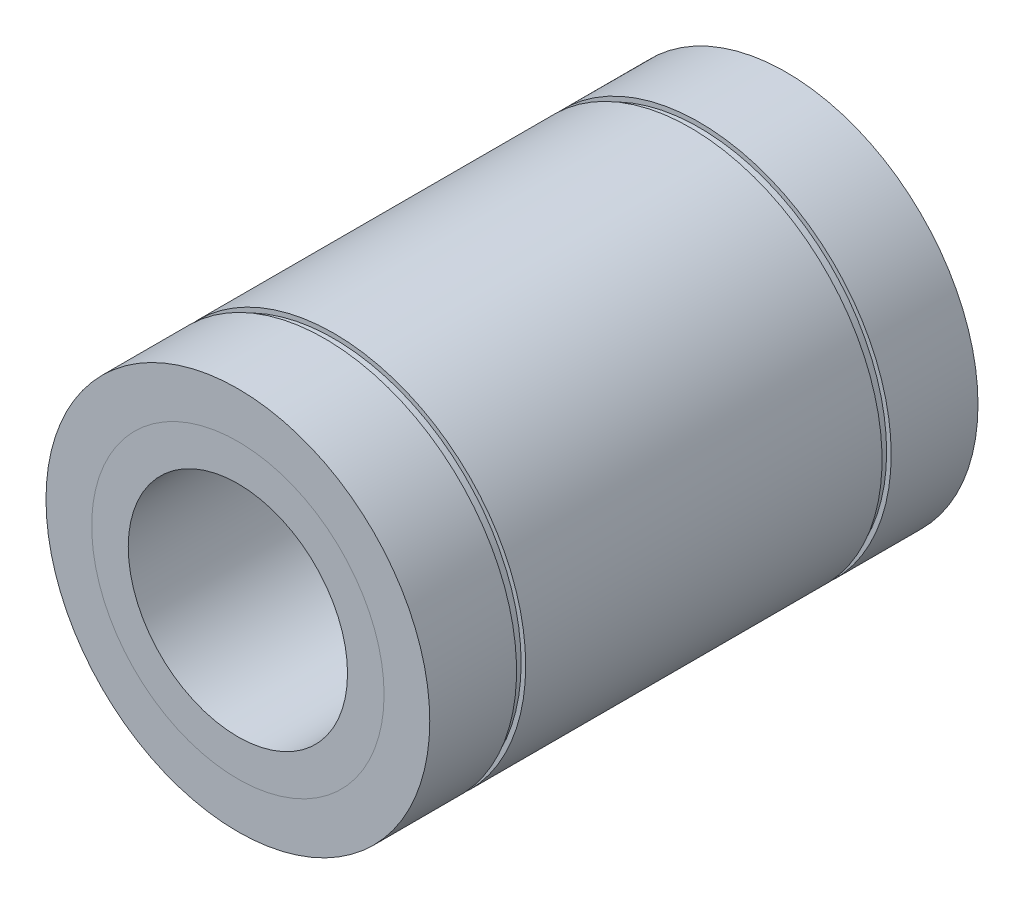
ISO-10303-21;
HEADER;
FILE_DESCRIPTION(('STEP AP214'),'2;1');
FILE_NAME('part.step','',(''),(''),'','','');
FILE_SCHEMA(('AUTOMOTIVE_DESIGN { 1 0 10303 214 1 1 1 1 }'));
ENDSEC;
DATA;
#1=APPLICATION_CONTEXT('core data for automotive mechanical design processes');
#2=APPLICATION_PROTOCOL_DEFINITION('international standard','automotive_design',2000,#1);
#3=PRODUCT_CONTEXT('',#1,'mechanical');
#4=PRODUCT('Part','Part','',(#3));
#5=PRODUCT_RELATED_PRODUCT_CATEGORY('part','',(#4));
#6=PRODUCT_DEFINITION_FORMATION('','',#4);
#7=PRODUCT_DEFINITION_CONTEXT('part definition',#1,'design');
#8=PRODUCT_DEFINITION('design','',#6,#7);
#9=PRODUCT_DEFINITION_SHAPE('','',#8);
#10=(LENGTH_UNIT() NAMED_UNIT(*) SI_UNIT(.MILLI.,.METRE.));
#11=(NAMED_UNIT(*) PLANE_ANGLE_UNIT() SI_UNIT($,.RADIAN.));
#12=(NAMED_UNIT(*) SI_UNIT($,.STERADIAN.) SOLID_ANGLE_UNIT());
#13=UNCERTAINTY_MEASURE_WITH_UNIT(LENGTH_MEASURE(1.E-05),#10,'distance_accuracy_value','');
#14=(GEOMETRIC_REPRESENTATION_CONTEXT(3) GLOBAL_UNCERTAINTY_ASSIGNED_CONTEXT((#13)) GLOBAL_UNIT_ASSIGNED_CONTEXT((#10,
#11,#12)) REPRESENTATION_CONTEXT('',''));
#15=CARTESIAN_POINT('',(0.,0.,0.));
#16=DIRECTION('',(0.,0.,1.));
#17=DIRECTION('',(1.,0.,0.));
#18=AXIS2_PLACEMENT_3D('',#15,#16,#17);
#19=CARTESIAN_POINT('',(0.,0.,15.));
#20=DIRECTION('',(0.,0.,1.));
#21=DIRECTION('',(1.,0.,0.));
#22=AXIS2_PLACEMENT_3D('',#19,#20,#21);
#23=PLANE('',#22);
#24=CARTESIAN_POINT('',(0.,0.,15.));
#25=DIRECTION('',(0.,0.,1.));
#26=DIRECTION('',(1.,0.,0.));
#27=AXIS2_PLACEMENT_3D('',#24,#25,#26);
#28=CIRCLE('',#27,8.);
#29=CARTESIAN_POINT('',(8.,0.,15.));
#30=VERTEX_POINT('',#29);
#31=EDGE_CURVE('E11',#30,#30,#28,.T.);
#32=ORIENTED_EDGE('',*,*,#31,.T.);
#33=EDGE_LOOP('',(#32));
#34=FACE_BOUND('',#33,.T.);
#35=CARTESIAN_POINT('',(0.,0.,15.));
#36=DIRECTION('',(0.,0.,1.));
#37=DIRECTION('',(1.,0.,0.));
#38=AXIS2_PLACEMENT_3D('',#35,#36,#37);
#39=CIRCLE('',#38,6.);
#40=CARTESIAN_POINT('',(6.,0.,15.));
#41=VERTEX_POINT('',#40);
#42=EDGE_CURVE('E62',#41,#41,#39,.T.);
#43=ORIENTED_EDGE('',*,*,#42,.F.);
#44=EDGE_LOOP('',(#43));
#45=FACE_BOUND('',#44,.T.);
#46=ADVANCED_FACE('F51',(#34,#45),#23,.T.);
#47=CARTESIAN_POINT('',(0.,0.,-15.));
#48=DIRECTION('',(0.,0.,1.));
#49=DIRECTION('',(1.,0.,0.));
#50=AXIS2_PLACEMENT_3D('',#47,#48,#49);
#51=PLANE('',#50);
#52=CARTESIAN_POINT('',(0.,0.,-15.));
#53=DIRECTION('',(0.,0.,1.));
#54=DIRECTION('',(1.,0.,0.));
#55=AXIS2_PLACEMENT_3D('',#52,#53,#54);
#56=CIRCLE('',#55,8.);
#57=CARTESIAN_POINT('',(8.,0.,-15.));
#58=VERTEX_POINT('',#57);
#59=EDGE_CURVE('E55',#58,#58,#56,.T.);
#60=ORIENTED_EDGE('',*,*,#59,.F.);
#61=EDGE_LOOP('',(#60));
#62=FACE_BOUND('',#61,.T.);
#63=CARTESIAN_POINT('',(0.,0.,-15.));
#64=DIRECTION('',(0.,0.,1.));
#65=DIRECTION('',(1.,0.,0.));
#66=AXIS2_PLACEMENT_3D('',#63,#64,#65);
#67=CIRCLE('',#66,6.);
#68=CARTESIAN_POINT('',(6.,0.,-15.));
#69=VERTEX_POINT('',#68);
#70=EDGE_CURVE('E64',#69,#69,#67,.T.);
#71=ORIENTED_EDGE('',*,*,#70,.T.);
#72=EDGE_LOOP('',(#71));
#73=FACE_BOUND('',#72,.T.);
#74=ADVANCED_FACE('F74',(#62,#73),#51,.F.);
#75=CARTESIAN_POINT('',(0.,0.,15.));
#76=DIRECTION('',(0.,0.,-1.));
#77=DIRECTION('',(-1.,0.,0.));
#78=AXIS2_PLACEMENT_3D('',#75,#76,#77);
#79=CYLINDRICAL_SURFACE('',#78,8.);
#80=ORIENTED_EDGE('',*,*,#31,.F.);
#81=EDGE_LOOP('',(#80));
#82=FACE_BOUND('',#81,.T.);
#83=ORIENTED_EDGE('',*,*,#59,.T.);
#84=EDGE_LOOP('',(#83));
#85=FACE_BOUND('',#84,.T.);
#86=ADVANCED_FACE('F53',(#82,#85),#79,.T.);
#87=CARTESIAN_POINT('',(0.,0.,15.));
#88=DIRECTION('',(0.,0.,-1.));
#89=DIRECTION('',(-1.,0.,0.));
#90=AXIS2_PLACEMENT_3D('',#87,#88,#89);
#91=CYLINDRICAL_SURFACE('',#90,6.);
#92=ORIENTED_EDGE('',*,*,#42,.T.);
#93=EDGE_LOOP('',(#92));
#94=FACE_BOUND('',#93,.T.);
#95=ORIENTED_EDGE('',*,*,#70,.F.);
#96=EDGE_LOOP('',(#95));
#97=FACE_BOUND('',#96,.T.);
#98=ADVANCED_FACE('F70',(#94,#97),#91,.F.);
#99=CLOSED_SHELL('',(#46,#74,#86,#98));
#100=MANIFOLD_SOLID_BREP('B2',#99);
#101=CARTESIAN_POINT('',(0.,0.,15.));
#102=DIRECTION('',(0.,0.,-1.));
#103=DIRECTION('',(-1.,0.,0.));
#104=AXIS2_PLACEMENT_3D('',#101,#102,#103);
#105=CYLINDRICAL_SURFACE('',#104,10.5);
#106=CARTESIAN_POINT('',(0.,0.,15.));
#107=DIRECTION('',(0.,0.,1.));
#108=DIRECTION('',(1.,0.,0.));
#109=AXIS2_PLACEMENT_3D('',#106,#107,#108);
#110=CIRCLE('',#109,10.5);
#111=CARTESIAN_POINT('',(10.5,0.,15.));
#112=VERTEX_POINT('',#111);
#113=EDGE_CURVE('E50',#112,#112,#110,.T.);
#114=ORIENTED_EDGE('',*,*,#113,.F.);
#115=EDGE_LOOP('',(#114));
#116=FACE_BOUND('',#115,.T.);
#117=CARTESIAN_POINT('',(0.,0.,10.25));
#118=DIRECTION('',(0.,0.,-1.));
#119=DIRECTION('',(-1.,0.,0.));
#120=AXIS2_PLACEMENT_3D('',#117,#118,#119);
#121=CIRCLE('',#120,10.5);
#122=CARTESIAN_POINT('',(-10.5,0.,10.25));
#123=VERTEX_POINT('',#122);
#124=EDGE_CURVE('E150',#123,#123,#121,.T.);
#125=ORIENTED_EDGE('',*,*,#124,.F.);
#126=EDGE_LOOP('',(#125));
#127=FACE_BOUND('',#126,.T.);
#128=ADVANCED_FACE('F121',(#116,#127),#105,.T.);
#129=CARTESIAN_POINT('',(0.,0.,-15.));
#130=DIRECTION('',(0.,0.,1.));
#131=DIRECTION('',(1.,0.,0.));
#132=AXIS2_PLACEMENT_3D('',#129,#130,#131);
#133=CIRCLE('',#132,10.5);
#134=CARTESIAN_POINT('',(10.5,0.,-15.));
#135=VERTEX_POINT('',#134);
#136=EDGE_CURVE('E130',#135,#135,#133,.T.);
#137=ORIENTED_EDGE('',*,*,#136,.T.);
#138=EDGE_LOOP('',(#137));
#139=FACE_BOUND('',#138,.T.);
#140=CARTESIAN_POINT('',(0.,0.,-10.25));
#141=DIRECTION('',(0.,0.,1.));
#142=DIRECTION('',(1.,0.,0.));
#143=AXIS2_PLACEMENT_3D('',#140,#141,#142);
#144=CIRCLE('',#143,10.5);
#145=CARTESIAN_POINT('',(10.5,0.,-10.25));
#146=VERTEX_POINT('',#145);
#147=EDGE_CURVE('E146',#146,#146,#144,.T.);
#148=ORIENTED_EDGE('',*,*,#147,.F.);
#149=EDGE_LOOP('',(#148));
#150=FACE_BOUND('',#149,.T.);
#151=ADVANCED_FACE('F195',(#139,#150),#105,.T.);
#152=CARTESIAN_POINT('',(0.,0.,15.));
#153=DIRECTION('',(0.,0.,1.));
#154=DIRECTION('',(1.,0.,0.));
#155=AXIS2_PLACEMENT_3D('',#152,#153,#154);
#156=PLANE('',#155);
#157=ORIENTED_EDGE('',*,*,#113,.T.);
#158=EDGE_LOOP('',(#157));
#159=FACE_BOUND('',#158,.T.);
#160=CARTESIAN_POINT('',(0.,0.,15.));
#161=DIRECTION('',(0.,0.,1.));
#162=DIRECTION('',(1.,0.,0.));
#163=AXIS2_PLACEMENT_3D('',#160,#161,#162);
#164=CIRCLE('',#163,8.);
#165=CARTESIAN_POINT('',(8.,0.,15.));
#166=VERTEX_POINT('',#165);
#167=EDGE_CURVE('E136',#166,#166,#164,.T.);
#168=ORIENTED_EDGE('',*,*,#167,.F.);
#169=EDGE_LOOP('',(#168));
#170=FACE_BOUND('',#169,.T.);
#171=ADVANCED_FACE('F205',(#159,#170),#156,.T.);
#172=CARTESIAN_POINT('',(0.,0.,-15.));
#173=DIRECTION('',(0.,0.,1.));
#174=DIRECTION('',(1.,0.,0.));
#175=AXIS2_PLACEMENT_3D('',#172,#173,#174);
#176=PLANE('',#175);
#177=ORIENTED_EDGE('',*,*,#136,.F.);
#178=EDGE_LOOP('',(#177));
#179=FACE_BOUND('',#178,.T.);
#180=CARTESIAN_POINT('',(0.,0.,-15.));
#181=DIRECTION('',(0.,0.,1.));
#182=DIRECTION('',(1.,0.,0.));
#183=AXIS2_PLACEMENT_3D('',#180,#181,#182);
#184=CIRCLE('',#183,8.);
#185=CARTESIAN_POINT('',(8.,0.,-15.));
#186=VERTEX_POINT('',#185);
#187=EDGE_CURVE('E139',#186,#186,#184,.T.);
#188=ORIENTED_EDGE('',*,*,#187,.T.);
#189=EDGE_LOOP('',(#188));
#190=FACE_BOUND('',#189,.T.);
#191=ADVANCED_FACE('F211',(#179,#190),#176,.F.);
#192=CARTESIAN_POINT('',(0.,0.,15.));
#193=DIRECTION('',(0.,0.,-1.));
#194=DIRECTION('',(-1.,0.,0.));
#195=AXIS2_PLACEMENT_3D('',#192,#193,#194);
#196=CYLINDRICAL_SURFACE('',#195,8.);
#197=ORIENTED_EDGE('',*,*,#167,.T.);
#198=EDGE_LOOP('',(#197));
#199=FACE_BOUND('',#198,.T.);
#200=ORIENTED_EDGE('',*,*,#187,.F.);
#201=EDGE_LOOP('',(#200));
#202=FACE_BOUND('',#201,.T.);
#203=ADVANCED_FACE('F220',(#199,#202),#196,.F.);
#204=CARTESIAN_POINT('',(-10.75,0.,-10.25));
#205=DIRECTION('',(0.,0.,1.));
#206=DIRECTION('',(1.,0.,0.));
#207=AXIS2_PLACEMENT_3D('',#204,#205,#206);
#208=PLANE('',#207);
#209=CARTESIAN_POINT('',(0.,0.,-10.25));
#210=DIRECTION('',(0.,0.,1.));
#211=DIRECTION('',(1.,0.,0.));
#212=AXIS2_PLACEMENT_3D('',#209,#210,#211);
#213=CIRCLE('',#212,10.25);
#214=CARTESIAN_POINT('',(10.25,0.,-10.25));
#215=VERTEX_POINT('',#214);
#216=EDGE_CURVE('E168',#215,#215,#213,.T.);
#217=ORIENTED_EDGE('',*,*,#216,.F.);
#218=EDGE_LOOP('',(#217));
#219=FACE_BOUND('',#218,.T.);
#220=ORIENTED_EDGE('',*,*,#147,.T.);
#221=EDGE_LOOP('',(#220));
#222=FACE_BOUND('',#221,.T.);
#223=ADVANCED_FACE('F217',(#219,#222),#208,.T.);
#224=CARTESIAN_POINT('',(-10.75,0.,-9.75));
#225=DIRECTION('',(0.,0.,-1.));
#226=DIRECTION('',(-1.,0.,0.));
#227=AXIS2_PLACEMENT_3D('',#224,#225,#226);
#228=PLANE('',#227);
#229=CARTESIAN_POINT('',(0.,0.,-9.75));
#230=DIRECTION('',(0.,0.,1.));
#231=DIRECTION('',(1.,0.,0.));
#232=AXIS2_PLACEMENT_3D('',#229,#230,#231);
#233=CIRCLE('',#232,10.25);
#234=CARTESIAN_POINT('',(10.25,0.,-9.75));
#235=VERTEX_POINT('',#234);
#236=EDGE_CURVE('E173',#235,#235,#233,.T.);
#237=ORIENTED_EDGE('',*,*,#236,.T.);
#238=EDGE_LOOP('',(#237));
#239=FACE_BOUND('',#238,.T.);
#240=CARTESIAN_POINT('',(0.,0.,-9.75));
#241=DIRECTION('',(0.,0.,-1.));
#242=DIRECTION('',(-1.,0.,0.));
#243=AXIS2_PLACEMENT_3D('',#240,#241,#242);
#244=CIRCLE('',#243,10.5);
#245=CARTESIAN_POINT('',(-10.5,0.,-9.75));
#246=VERTEX_POINT('',#245);
#247=EDGE_CURVE('E142',#246,#246,#244,.T.);
#248=ORIENTED_EDGE('',*,*,#247,.T.);
#249=EDGE_LOOP('',(#248));
#250=FACE_BOUND('',#249,.T.);
#251=ADVANCED_FACE('F219',(#239,#250),#228,.T.);
#252=CARTESIAN_POINT('',(0.,0.,15.));
#253=DIRECTION('',(0.,0.,1.));
#254=DIRECTION('',(1.,0.,0.));
#255=AXIS2_PLACEMENT_3D('',#252,#253,#254);
#256=CYLINDRICAL_SURFACE('',#255,10.25);
#257=ORIENTED_EDGE('',*,*,#216,.T.);
#258=EDGE_LOOP('',(#257));
#259=FACE_BOUND('',#258,.T.);
#260=ORIENTED_EDGE('',*,*,#236,.F.);
#261=EDGE_LOOP('',(#260));
#262=FACE_BOUND('',#261,.T.);
#263=ADVANCED_FACE('F227',(#259,#262),#256,.T.);
#264=CARTESIAN_POINT('',(-10.75,0.,9.75));
#265=DIRECTION('',(0.,0.,1.));
#266=DIRECTION('',(1.,0.,0.));
#267=AXIS2_PLACEMENT_3D('',#264,#265,#266);
#268=PLANE('',#267);
#269=CARTESIAN_POINT('',(0.,0.,9.75));
#270=DIRECTION('',(0.,0.,1.));
#271=DIRECTION('',(1.,0.,0.));
#272=AXIS2_PLACEMENT_3D('',#269,#270,#271);
#273=CIRCLE('',#272,10.25);
#274=CARTESIAN_POINT('',(10.25,0.,9.75));
#275=VERTEX_POINT('',#274);
#276=EDGE_CURVE('E147',#275,#275,#273,.T.);
#277=ORIENTED_EDGE('',*,*,#276,.F.);
#278=EDGE_LOOP('',(#277));
#279=FACE_BOUND('',#278,.T.);
#280=CARTESIAN_POINT('',(0.,0.,9.75));
#281=DIRECTION('',(0.,0.,1.));
#282=DIRECTION('',(1.,0.,0.));
#283=AXIS2_PLACEMENT_3D('',#280,#281,#282);
#284=CIRCLE('',#283,10.5);
#285=CARTESIAN_POINT('',(10.5,0.,9.75));
#286=VERTEX_POINT('',#285);
#287=EDGE_CURVE('E125',#286,#286,#284,.T.);
#288=ORIENTED_EDGE('',*,*,#287,.T.);
#289=EDGE_LOOP('',(#288));
#290=FACE_BOUND('',#289,.T.);
#291=ADVANCED_FACE('F196',(#279,#290),#268,.T.);
#292=CARTESIAN_POINT('',(-10.75,0.,10.25));
#293=DIRECTION('',(0.,0.,-1.));
#294=DIRECTION('',(-1.,0.,0.));
#295=AXIS2_PLACEMENT_3D('',#292,#293,#294);
#296=PLANE('',#295);
#297=CARTESIAN_POINT('',(0.,0.,10.25));
#298=DIRECTION('',(0.,0.,1.));
#299=DIRECTION('',(1.,0.,0.));
#300=AXIS2_PLACEMENT_3D('',#297,#298,#299);
#301=CIRCLE('',#300,10.25);
#302=CARTESIAN_POINT('',(10.25,0.,10.25));
#303=VERTEX_POINT('',#302);
#304=EDGE_CURVE('E172',#303,#303,#301,.T.);
#305=ORIENTED_EDGE('',*,*,#304,.T.);
#306=EDGE_LOOP('',(#305));
#307=FACE_BOUND('',#306,.T.);
#308=ORIENTED_EDGE('',*,*,#124,.T.);
#309=EDGE_LOOP('',(#308));
#310=FACE_BOUND('',#309,.T.);
#311=ADVANCED_FACE('F184',(#307,#310),#296,.T.);
#312=CARTESIAN_POINT('',(0.,0.,15.));
#313=DIRECTION('',(0.,0.,1.));
#314=DIRECTION('',(1.,0.,0.));
#315=AXIS2_PLACEMENT_3D('',#312,#313,#314);
#316=CYLINDRICAL_SURFACE('',#315,10.25);
#317=ORIENTED_EDGE('',*,*,#276,.T.);
#318=EDGE_LOOP('',(#317));
#319=FACE_BOUND('',#318,.T.);
#320=ORIENTED_EDGE('',*,*,#304,.F.);
#321=EDGE_LOOP('',(#320));
#322=FACE_BOUND('',#321,.T.);
#323=ADVANCED_FACE('F186',(#319,#322),#316,.T.);
#324=ORIENTED_EDGE('',*,*,#247,.F.);
#325=EDGE_LOOP('',(#324));
#326=FACE_BOUND('',#325,.T.);
#327=ORIENTED_EDGE('',*,*,#287,.F.);
#328=EDGE_LOOP('',(#327));
#329=FACE_BOUND('',#328,.T.);
#330=ADVANCED_FACE('F123',(#326,#329),#105,.T.);
#331=CLOSED_SHELL('',(#128,#151,#171,#191,#203,#223,#251,#263,#291,#311,#323,#330));
#332=MANIFOLD_SOLID_BREP('B6',#331);
#333=ADVANCED_BREP_SHAPE_REPRESENTATION('',(#18,#100,#332),#14);
#334=SHAPE_DEFINITION_REPRESENTATION(#9,#333);
ENDSEC;
END-ISO-10303-21;
